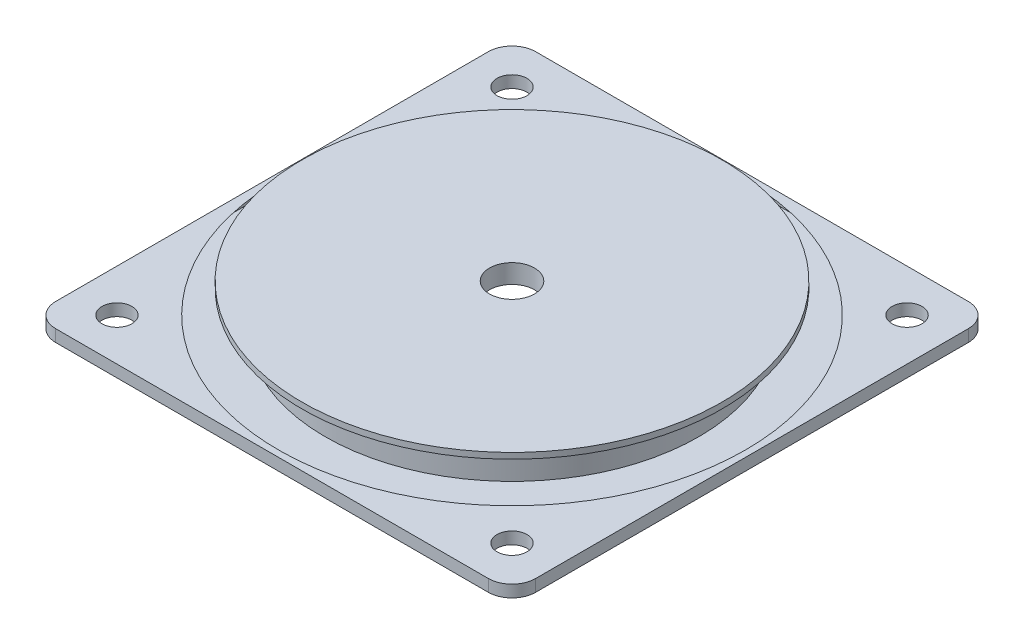
ISO-10303-21;
HEADER;
FILE_DESCRIPTION(('STEP AP214'),'2;1');
FILE_NAME('part.step','',(''),(''),'','','');
FILE_SCHEMA(('AUTOMOTIVE_DESIGN { 1 0 10303 214 1 1 1 1 }'));
ENDSEC;
DATA;
#1=APPLICATION_CONTEXT('core data for automotive mechanical design processes');
#2=APPLICATION_PROTOCOL_DEFINITION('international standard','automotive_design',2000,#1);
#3=PRODUCT_CONTEXT('',#1,'mechanical');
#4=PRODUCT('Part','Part','',(#3));
#5=PRODUCT_RELATED_PRODUCT_CATEGORY('part','',(#4));
#6=PRODUCT_DEFINITION_FORMATION('','',#4);
#7=PRODUCT_DEFINITION_CONTEXT('part definition',#1,'design');
#8=PRODUCT_DEFINITION('design','',#6,#7);
#9=PRODUCT_DEFINITION_SHAPE('','',#8);
#10=(LENGTH_UNIT() NAMED_UNIT(*) SI_UNIT(.MILLI.,.METRE.));
#11=(NAMED_UNIT(*) PLANE_ANGLE_UNIT() SI_UNIT($,.RADIAN.));
#12=(NAMED_UNIT(*) SI_UNIT($,.STERADIAN.) SOLID_ANGLE_UNIT());
#13=UNCERTAINTY_MEASURE_WITH_UNIT(LENGTH_MEASURE(1.E-05),#10,'distance_accuracy_value','');
#14=(GEOMETRIC_REPRESENTATION_CONTEXT(3) GLOBAL_UNCERTAINTY_ASSIGNED_CONTEXT((#13)) GLOBAL_UNIT_ASSIGNED_CONTEXT((#10,
#11,#12)) REPRESENTATION_CONTEXT('',''));
#15=CARTESIAN_POINT('',(0.,0.,0.));
#16=DIRECTION('',(0.,0.,1.));
#17=DIRECTION('',(1.,0.,0.));
#18=AXIS2_PLACEMENT_3D('',#15,#16,#17);
#19=CARTESIAN_POINT('',(-124.602514331042,-133.947084493501,-454.087475190436));
#20=DIRECTION('',(0.,1.,0.));
#21=DIRECTION('',(0.,0.,-1.));
#22=AXIS2_PLACEMENT_3D('',#19,#20,#21);
#23=PLANE('',#22);
#24=CARTESIAN_POINT('',(-124.602514331042,-133.947084493501,-454.087475190436));
#25=DIRECTION('',(0.,-1.,0.));
#26=DIRECTION('',(-1.,0.,0.));
#27=AXIS2_PLACEMENT_3D('',#24,#25,#26);
#28=CIRCLE('',#27,4.7625);
#29=CARTESIAN_POINT('',(-119.840014331042,-133.947084493501,-454.087475190436));
#30=VERTEX_POINT('',#29);
#31=EDGE_CURVE('E226',#30,#30,#28,.T.);
#32=ORIENTED_EDGE('',*,*,#31,.T.);
#33=EDGE_LOOP('',(#32));
#34=FACE_BOUND('',#33,.T.);
#35=CARTESIAN_POINT('',(-124.602514331042,-133.947084493501,-454.087475190436));
#36=DIRECTION('',(0.,1.,0.));
#37=DIRECTION('',(-0.994877763250626,0.,-0.101085291657253));
#38=AXIS2_PLACEMENT_3D('',#35,#36,#37);
#39=CIRCLE('',#38,44.45);
#40=CARTESIAN_POINT('',(-80.3801977545518,-133.947084493501,-449.594233976272));
#41=VERTEX_POINT('',#40);
#42=EDGE_CURVE('E11',#41,#41,#39,.T.);
#43=ORIENTED_EDGE('',*,*,#42,.T.);
#44=EDGE_LOOP('',(#43));
#45=FACE_BOUND('',#44,.T.);
#46=ADVANCED_FACE('F55',(#34,#45),#23,.T.);
#47=CARTESIAN_POINT('',(-124.602514331042,-143.847084493501,-454.087475190436));
#48=DIRECTION('',(0.,-1.,0.));
#49=DIRECTION('',(-0.994877763250626,0.,-0.101085291657253));
#50=AXIS2_PLACEMENT_3D('',#47,#48,#49);
#51=CYLINDRICAL_SURFACE('',#50,44.45);
#52=CARTESIAN_POINT('',(-124.602514331042,-135.1970844935,-454.087475190436));
#53=DIRECTION('',(0.,-1.,0.));
#54=DIRECTION('',(0.994877763250626,0.,0.101085291657253));
#55=AXIS2_PLACEMENT_3D('',#52,#53,#54);
#56=CIRCLE('',#55,44.45);
#57=CARTESIAN_POINT('',(-168.824830907532,-135.197084493501,-458.580716404601));
#58=VERTEX_POINT('',#57);
#59=CARTESIAN_POINT('',(-80.3801977545518,-135.197084493501,-449.594233976272));
#60=VERTEX_POINT('',#59);
#61=EDGE_CURVE('E210',#58,#60,#56,.T.);
#62=ORIENTED_EDGE('',*,*,#61,.F.);
#63=CARTESIAN_POINT('',(-124.602514331042,-135.1970844935,-454.087475190436));
#64=DIRECTION('',(0.,-1.,0.));
#65=DIRECTION('',(0.994877763250626,0.,0.101085291657253));
#66=AXIS2_PLACEMENT_3D('',#63,#64,#65);
#67=CIRCLE('',#66,44.45);
#68=EDGE_CURVE('E207',#60,#58,#67,.T.);
#69=ORIENTED_EDGE('',*,*,#68,.F.);
#70=DIRECTION('',(0.,1.,0.));
#71=VECTOR('',#70,1.);
#72=CARTESIAN_POINT('',(-80.3801977545518,-143.847084493501,-449.594233976272));
#73=LINE('',#72,#71);
#74=EDGE_CURVE('E63',#60,#41,#73,.T.);
#75=ORIENTED_EDGE('',*,*,#74,.T.);
#76=ORIENTED_EDGE('',*,*,#42,.F.);
#77=ORIENTED_EDGE('',*,*,#74,.F.);
#78=EDGE_LOOP('',(#62,#69,#75,#76,#77));
#79=FACE_BOUND('',#78,.T.);
#80=ADVANCED_FACE('F375',(#79),#51,.T.);
#81=CARTESIAN_POINT('',(-124.602514331042,-140.197084493501,-454.087475190436));
#82=DIRECTION('',(0.,1.,0.));
#83=DIRECTION('',(0.994877763250626,0.,0.101085291657253));
#84=AXIS2_PLACEMENT_3D('',#81,#82,#83);
#85=CYLINDRICAL_SURFACE('',#84,39.5466067773413);
#86=CARTESIAN_POINT('',(-124.602514331042,-142.737084493501,-454.087475190436));
#87=DIRECTION('',(0.,1.,0.));
#88=DIRECTION('',(-1.,0.,0.));
#89=AXIS2_PLACEMENT_3D('',#86,#87,#88);
#90=CIRCLE('',#89,39.5466067773413);
#91=CARTESIAN_POINT('',(-163.946554025835,-142.737084493501,-458.085055470579));
#92=VERTEX_POINT('',#91);
#93=EDGE_CURVE('E366',#92,#92,#90,.T.);
#94=ORIENTED_EDGE('',*,*,#93,.F.);
#95=DIRECTION('',(0.,1.,0.));
#96=VECTOR('',#95,1.);
#97=CARTESIAN_POINT('',(-163.946554025835,-140.197084493501,-458.085055470579));
#98=LINE('',#97,#96);
#99=CARTESIAN_POINT('',(-163.946554025835,-137.947084493501,-458.085055470579));
#100=VERTEX_POINT('',#99);
#101=EDGE_CURVE('E81',#92,#100,#98,.T.);
#102=ORIENTED_EDGE('',*,*,#101,.T.);
#103=CARTESIAN_POINT('',(-124.602514331042,-137.947084493501,-454.087475190436));
#104=DIRECTION('',(0.,1.,0.));
#105=DIRECTION('',(0.994877763250626,0.,0.101085291657253));
#106=AXIS2_PLACEMENT_3D('',#103,#104,#105);
#107=CIRCLE('',#106,39.5466067773413);
#108=EDGE_CURVE('E235',#100,#100,#107,.T.);
#109=ORIENTED_EDGE('',*,*,#108,.T.);
#110=ORIENTED_EDGE('',*,*,#101,.F.);
#111=EDGE_LOOP('',(#94,#102,#109,#110));
#112=FACE_BOUND('',#111,.T.);
#113=ADVANCED_FACE('F377',(#112),#85,.F.);
#114=CARTESIAN_POINT('',(-170.402514331042,-142.737084493501,-408.287475190437));
#115=DIRECTION('',(0.,1.,0.));
#116=DIRECTION('',(-0.707106781186548,0.,0.707106781186548));
#117=AXIS2_PLACEMENT_3D('',#114,#115,#116);
#118=CYLINDRICAL_SURFACE('',#117,5.);
#119=CARTESIAN_POINT('',(-170.402514331042,-140.197084493501,-408.287475190437));
#120=DIRECTION('',(0.,-1.,0.));
#121=DIRECTION('',(-0.707106781186548,0.,0.707106781186548));
#122=AXIS2_PLACEMENT_3D('',#119,#120,#121);
#123=CIRCLE('',#122,5.);
#124=CARTESIAN_POINT('',(-170.402514331042,-140.197084493501,-403.287475190437));
#125=VERTEX_POINT('',#124);
#126=CARTESIAN_POINT('',(-175.402514331042,-140.197084493501,-408.287475190437));
#127=VERTEX_POINT('',#126);
#128=EDGE_CURVE('E315',#125,#127,#123,.T.);
#129=ORIENTED_EDGE('',*,*,#128,.T.);
#130=DIRECTION('',(0.,-1.,0.));
#131=VECTOR('',#130,1.);
#132=CARTESIAN_POINT('',(-175.402514331042,-142.737084493501,-408.287475190437));
#133=LINE('',#132,#131);
#134=CARTESIAN_POINT('',(-175.402514331042,-142.737084493501,-408.287475190437));
#135=VERTEX_POINT('',#134);
#136=EDGE_CURVE('E232',#127,#135,#133,.T.);
#137=ORIENTED_EDGE('',*,*,#136,.T.);
#138=CARTESIAN_POINT('',(-170.402514331042,-142.7370844935,-408.287475190437));
#139=DIRECTION('',(0.,1.,0.));
#140=DIRECTION('',(-0.707106781186548,0.,0.707106781186548));
#141=AXIS2_PLACEMENT_3D('',#138,#139,#140);
#142=CIRCLE('',#141,5.);
#143=CARTESIAN_POINT('',(-170.402514331042,-142.7370844935,-403.287475190437));
#144=VERTEX_POINT('',#143);
#145=EDGE_CURVE('E357',#135,#144,#142,.T.);
#146=ORIENTED_EDGE('',*,*,#145,.T.);
#147=DIRECTION('',(0.,1.,0.));
#148=VECTOR('',#147,1.);
#149=CARTESIAN_POINT('',(-170.402514331042,-142.737084493501,-403.287475190437));
#150=LINE('',#149,#148);
#151=EDGE_CURVE('E359',#144,#125,#150,.T.);
#152=ORIENTED_EDGE('',*,*,#151,.T.);
#153=EDGE_LOOP('',(#129,#137,#146,#152));
#154=FACE_BOUND('',#153,.T.);
#155=ADVANCED_FACE('F384',(#154),#118,.T.);
#156=CARTESIAN_POINT('',(-175.402514331042,-142.7370844935,-403.287475190437));
#157=DIRECTION('',(0.,0.,1.));
#158=DIRECTION('',(0.,-1.,0.));
#159=AXIS2_PLACEMENT_3D('',#156,#157,#158);
#160=PLANE('',#159);
#161=ORIENTED_EDGE('',*,*,#151,.F.);
#162=DIRECTION('',(1.,0.,0.));
#163=VECTOR('',#162,1.);
#164=CARTESIAN_POINT('',(-175.402514331042,-142.7370844935,-403.287475190437));
#165=LINE('',#164,#163);
#166=CARTESIAN_POINT('',(-78.8025143310422,-142.737084493501,-403.287475190437));
#167=VERTEX_POINT('',#166);
#168=EDGE_CURVE('E363',#144,#167,#165,.T.);
#169=ORIENTED_EDGE('',*,*,#168,.T.);
#170=DIRECTION('',(0.,-1.,0.));
#171=VECTOR('',#170,1.);
#172=CARTESIAN_POINT('',(-78.8025143310422,-142.737084493501,-403.287475190437));
#173=LINE('',#172,#171);
#174=CARTESIAN_POINT('',(-78.8025143310422,-140.197084493501,-403.287475190437));
#175=VERTEX_POINT('',#174);
#176=EDGE_CURVE('E302',#175,#167,#173,.T.);
#177=ORIENTED_EDGE('',*,*,#176,.F.);
#178=DIRECTION('',(1.,0.,0.));
#179=VECTOR('',#178,1.);
#180=CARTESIAN_POINT('',(-175.402514331042,-140.197084493501,-403.287475190437));
#181=LINE('',#180,#179);
#182=EDGE_CURVE('E335',#125,#175,#181,.T.);
#183=ORIENTED_EDGE('',*,*,#182,.F.);
#184=EDGE_LOOP('',(#161,#169,#177,#183));
#185=FACE_BOUND('',#184,.T.);
#186=ADVANCED_FACE('F441',(#185),#160,.T.);
#187=CARTESIAN_POINT('',(-124.602514331042,-142.737084493501,-454.087475190436));
#188=DIRECTION('',(0.,1.,0.));
#189=DIRECTION('',(1.,0.,0.));
#190=AXIS2_PLACEMENT_3D('',#187,#188,#189);
#191=PLANE('',#190);
#192=CARTESIAN_POINT('',(-82.7827704521111,-142.737084493501,-495.907219069366));
#193=DIRECTION('',(0.,1.,0.));
#194=DIRECTION('',(0.,0.,-1.));
#195=AXIS2_PLACEMENT_3D('',#192,#193,#194);
#196=CIRCLE('',#195,3.175);
#197=CARTESIAN_POINT('',(-82.7827704521111,-142.737084493501,-492.732219069366));
#198=VERTEX_POINT('',#197);
#199=EDGE_CURVE('E295',#198,#198,#196,.T.);
#200=ORIENTED_EDGE('',*,*,#199,.T.);
#201=EDGE_LOOP('',(#200));
#202=FACE_BOUND('',#201,.T.);
#203=CARTESIAN_POINT('',(-82.7827704521115,-142.737084493501,-412.267731311505));
#204=DIRECTION('',(0.,1.,0.));
#205=DIRECTION('',(1.,0.,0.));
#206=AXIS2_PLACEMENT_3D('',#203,#204,#205);
#207=CIRCLE('',#206,3.175);
#208=CARTESIAN_POINT('',(-85.9577704521114,-142.737084493501,-412.267731311505));
#209=VERTEX_POINT('',#208);
#210=EDGE_CURVE('E257',#209,#209,#207,.T.);
#211=ORIENTED_EDGE('',*,*,#210,.T.);
#212=EDGE_LOOP('',(#211));
#213=FACE_BOUND('',#212,.T.);
#214=CARTESIAN_POINT('',(-166.422258209973,-142.737084493501,-412.267731311505));
#215=DIRECTION('',(0.,1.,0.));
#216=DIRECTION('',(0.,0.,1.));
#217=AXIS2_PLACEMENT_3D('',#214,#215,#216);
#218=CIRCLE('',#217,3.175);
#219=CARTESIAN_POINT('',(-166.422258209973,-142.737084493501,-415.442731311505));
#220=VERTEX_POINT('',#219);
#221=EDGE_CURVE('E264',#220,#220,#218,.T.);
#222=ORIENTED_EDGE('',*,*,#221,.T.);
#223=EDGE_LOOP('',(#222));
#224=FACE_BOUND('',#223,.T.);
#225=CARTESIAN_POINT('',(-166.422258209973,-142.737084493501,-495.907219069367));
#226=DIRECTION('',(0.,1.,0.));
#227=DIRECTION('',(-1.,0.,0.));
#228=AXIS2_PLACEMENT_3D('',#225,#226,#227);
#229=CIRCLE('',#228,3.175);
#230=CARTESIAN_POINT('',(-163.247258209973,-142.737084493501,-495.907219069367));
#231=VERTEX_POINT('',#230);
#232=EDGE_CURVE('E252',#231,#231,#229,.T.);
#233=ORIENTED_EDGE('',*,*,#232,.T.);
#234=EDGE_LOOP('',(#233));
#235=FACE_BOUND('',#234,.T.);
#236=ORIENTED_EDGE('',*,*,#93,.T.);
#237=EDGE_LOOP('',(#236));
#238=FACE_BOUND('',#237,.T.);
#239=ORIENTED_EDGE('',*,*,#145,.F.);
#240=DIRECTION('',(0.,0.,1.));
#241=VECTOR('',#240,1.);
#242=CARTESIAN_POINT('',(-175.402514331042,-142.7370844935,-504.887475190437));
#243=LINE('',#242,#241);
#244=CARTESIAN_POINT('',(-175.402514331042,-142.7370844935,-499.887475190437));
#245=VERTEX_POINT('',#244);
#246=EDGE_CURVE('E218',#245,#135,#243,.T.);
#247=ORIENTED_EDGE('',*,*,#246,.F.);
#248=CARTESIAN_POINT('',(-170.402514331042,-142.7370844935,-499.887475190437));
#249=DIRECTION('',(0.,1.,0.));
#250=DIRECTION('',(-0.707106781186548,0.,-0.707106781186548));
#251=AXIS2_PLACEMENT_3D('',#248,#249,#250);
#252=CIRCLE('',#251,5.);
#253=CARTESIAN_POINT('',(-170.402514331042,-142.7370844935,-504.887475190437));
#254=VERTEX_POINT('',#253);
#255=EDGE_CURVE('E354',#254,#245,#252,.T.);
#256=ORIENTED_EDGE('',*,*,#255,.F.);
#257=DIRECTION('',(-1.,0.,0.));
#258=VECTOR('',#257,1.);
#259=CARTESIAN_POINT('',(-175.402514331042,-142.7370844935,-504.887475190437));
#260=LINE('',#259,#258);
#261=CARTESIAN_POINT('',(-78.8025143310422,-142.737084493501,-504.887475190437));
#262=VERTEX_POINT('',#261);
#263=EDGE_CURVE('E350',#262,#254,#260,.T.);
#264=ORIENTED_EDGE('',*,*,#263,.F.);
#265=CARTESIAN_POINT('',(-78.8025143310422,-142.737084493501,-499.887475190437));
#266=DIRECTION('',(0.,1.,0.));
#267=DIRECTION('',(0.707106781186548,0.,-0.707106781186548));
#268=AXIS2_PLACEMENT_3D('',#265,#266,#267);
#269=CIRCLE('',#268,5.);
#270=CARTESIAN_POINT('',(-73.8025143310422,-142.737084493501,-499.887475190437));
#271=VERTEX_POINT('',#270);
#272=EDGE_CURVE('E262',#271,#262,#269,.T.);
#273=ORIENTED_EDGE('',*,*,#272,.F.);
#274=DIRECTION('',(0.,0.,-1.));
#275=VECTOR('',#274,1.);
#276=CARTESIAN_POINT('',(-73.8025143310422,-142.737084493501,-504.887475190437));
#277=LINE('',#276,#275);
#278=CARTESIAN_POINT('',(-73.8025143310422,-142.737084493501,-408.287475190437));
#279=VERTEX_POINT('',#278);
#280=EDGE_CURVE('E263',#279,#271,#277,.T.);
#281=ORIENTED_EDGE('',*,*,#280,.F.);
#282=CARTESIAN_POINT('',(-78.8025143310422,-142.737084493501,-408.287475190437));
#283=DIRECTION('',(0.,1.,0.));
#284=DIRECTION('',(0.707106781186548,0.,0.707106781186548));
#285=AXIS2_PLACEMENT_3D('',#282,#283,#284);
#286=CIRCLE('',#285,5.);
#287=EDGE_CURVE('E306',#167,#279,#286,.T.);
#288=ORIENTED_EDGE('',*,*,#287,.F.);
#289=ORIENTED_EDGE('',*,*,#168,.F.);
#290=EDGE_LOOP('',(#239,#247,#256,#264,#273,#281,#288,#289));
#291=FACE_BOUND('',#290,.T.);
#292=ADVANCED_FACE('F393',(#202,#213,#224,#235,#238,#291),#191,.F.);
#293=CARTESIAN_POINT('',(-170.402514331042,-142.7370844935,-499.887475190437));
#294=DIRECTION('',(0.,1.,0.));
#295=DIRECTION('',(-0.707106781186548,0.,-0.707106781186548));
#296=AXIS2_PLACEMENT_3D('',#293,#294,#295);
#297=CYLINDRICAL_SURFACE('',#296,5.);
#298=CARTESIAN_POINT('',(-170.402514331042,-140.1970844935,-499.887475190437));
#299=DIRECTION('',(0.,-1.,0.));
#300=DIRECTION('',(-0.707106781186548,0.,-0.707106781186548));
#301=AXIS2_PLACEMENT_3D('',#298,#299,#300);
#302=CIRCLE('',#301,5.);
#303=CARTESIAN_POINT('',(-175.402514331042,-140.197084493501,-499.887475190437));
#304=VERTEX_POINT('',#303);
#305=CARTESIAN_POINT('',(-170.402514331042,-140.197084493501,-504.887475190437));
#306=VERTEX_POINT('',#305);
#307=EDGE_CURVE('E342',#304,#306,#302,.T.);
#308=ORIENTED_EDGE('',*,*,#307,.T.);
#309=DIRECTION('',(0.,-1.,0.));
#310=VECTOR('',#309,1.);
#311=CARTESIAN_POINT('',(-170.402514331042,-142.7370844935,-504.887475190437));
#312=LINE('',#311,#310);
#313=EDGE_CURVE('E346',#306,#254,#312,.T.);
#314=ORIENTED_EDGE('',*,*,#313,.T.);
#315=ORIENTED_EDGE('',*,*,#255,.T.);
#316=DIRECTION('',(0.,1.,0.));
#317=VECTOR('',#316,1.);
#318=CARTESIAN_POINT('',(-175.402514331042,-142.7370844935,-499.887475190437));
#319=LINE('',#318,#317);
#320=EDGE_CURVE('E231',#245,#304,#319,.T.);
#321=ORIENTED_EDGE('',*,*,#320,.T.);
#322=EDGE_LOOP('',(#308,#314,#315,#321));
#323=FACE_BOUND('',#322,.T.);
#324=ADVANCED_FACE('F389',(#323),#297,.T.);
#325=CARTESIAN_POINT('',(-175.402514331042,-142.7370844935,-504.887475190437));
#326=DIRECTION('',(0.,0.,-1.));
#327=DIRECTION('',(-1.,0.,0.));
#328=AXIS2_PLACEMENT_3D('',#325,#326,#327);
#329=PLANE('',#328);
#330=ORIENTED_EDGE('',*,*,#313,.F.);
#331=DIRECTION('',(-1.,0.,0.));
#332=VECTOR('',#331,1.);
#333=CARTESIAN_POINT('',(-175.402514331042,-140.197084493501,-504.887475190437));
#334=LINE('',#333,#332);
#335=CARTESIAN_POINT('',(-78.8025143310422,-140.197084493501,-504.887475190437));
#336=VERTEX_POINT('',#335);
#337=EDGE_CURVE('E338',#336,#306,#334,.T.);
#338=ORIENTED_EDGE('',*,*,#337,.F.);
#339=DIRECTION('',(0.,1.,0.));
#340=VECTOR('',#339,1.);
#341=CARTESIAN_POINT('',(-78.8025143310422,-142.737084493501,-504.887475190437));
#342=LINE('',#341,#340);
#343=EDGE_CURVE('E311',#262,#336,#342,.T.);
#344=ORIENTED_EDGE('',*,*,#343,.F.);
#345=ORIENTED_EDGE('',*,*,#263,.T.);
#346=EDGE_LOOP('',(#330,#338,#344,#345));
#347=FACE_BOUND('',#346,.T.);
#348=ADVANCED_FACE('F392',(#347),#329,.T.);
#349=CARTESIAN_POINT('',(-124.602514331042,-140.197084493501,-454.087475190436));
#350=DIRECTION('',(0.,1.,0.));
#351=DIRECTION('',(1.,0.,0.));
#352=AXIS2_PLACEMENT_3D('',#349,#350,#351);
#353=PLANE('',#352);
#354=CARTESIAN_POINT('',(-82.7827704521111,-140.197084493501,-495.907219069366));
#355=DIRECTION('',(0.,-1.,0.));
#356=DIRECTION('',(0.,0.,-1.));
#357=AXIS2_PLACEMENT_3D('',#354,#355,#356);
#358=CIRCLE('',#357,3.175);
#359=CARTESIAN_POINT('',(-82.7827704521111,-140.197084493501,-492.732219069366));
#360=VERTEX_POINT('',#359);
#361=EDGE_CURVE('E253',#360,#360,#358,.T.);
#362=ORIENTED_EDGE('',*,*,#361,.T.);
#363=EDGE_LOOP('',(#362));
#364=FACE_BOUND('',#363,.T.);
#365=CARTESIAN_POINT('',(-82.7827704521115,-140.197084493501,-412.267731311505));
#366=DIRECTION('',(0.,-1.,0.));
#367=DIRECTION('',(1.,0.,0.));
#368=AXIS2_PLACEMENT_3D('',#365,#366,#367);
#369=CIRCLE('',#368,3.175);
#370=CARTESIAN_POINT('',(-85.9577704521114,-140.197084493501,-412.267731311505));
#371=VERTEX_POINT('',#370);
#372=EDGE_CURVE('E267',#371,#371,#369,.T.);
#373=ORIENTED_EDGE('',*,*,#372,.T.);
#374=EDGE_LOOP('',(#373));
#375=FACE_BOUND('',#374,.T.);
#376=CARTESIAN_POINT('',(-166.422258209973,-140.197084493501,-412.267731311505));
#377=DIRECTION('',(0.,-1.,0.));
#378=DIRECTION('',(0.,0.,1.));
#379=AXIS2_PLACEMENT_3D('',#376,#377,#378);
#380=CIRCLE('',#379,3.175);
#381=CARTESIAN_POINT('',(-166.422258209973,-140.197084493501,-415.442731311505));
#382=VERTEX_POINT('',#381);
#383=EDGE_CURVE('E247',#382,#382,#380,.T.);
#384=ORIENTED_EDGE('',*,*,#383,.T.);
#385=EDGE_LOOP('',(#384));
#386=FACE_BOUND('',#385,.T.);
#387=CARTESIAN_POINT('',(-166.422258209973,-140.197084493501,-495.907219069367));
#388=DIRECTION('',(0.,-1.,0.));
#389=DIRECTION('',(-1.,0.,0.));
#390=AXIS2_PLACEMENT_3D('',#387,#388,#389);
#391=CIRCLE('',#390,3.175);
#392=CARTESIAN_POINT('',(-163.247258209973,-140.197084493501,-495.907219069367));
#393=VERTEX_POINT('',#392);
#394=EDGE_CURVE('E270',#393,#393,#391,.T.);
#395=ORIENTED_EDGE('',*,*,#394,.T.);
#396=EDGE_LOOP('',(#395));
#397=FACE_BOUND('',#396,.T.);
#398=CARTESIAN_POINT('',(-124.602514331042,-140.197084493501,-454.087475190436));
#399=DIRECTION('',(0.,1.,0.));
#400=DIRECTION('',(0.994877763250626,0.,0.101085291657253));
#401=AXIS2_PLACEMENT_3D('',#398,#399,#400);
#402=CIRCLE('',#401,49.45);
#403=CARTESIAN_POINT('',(-173.799219723785,-140.1970844935,-459.086142862888));
#404=VERTEX_POINT('',#403);
#405=EDGE_CURVE('E204',#404,#404,#402,.T.);
#406=ORIENTED_EDGE('',*,*,#405,.F.);
#407=EDGE_LOOP('',(#406));
#408=FACE_BOUND('',#407,.T.);
#409=ORIENTED_EDGE('',*,*,#128,.F.);
#410=ORIENTED_EDGE('',*,*,#182,.T.);
#411=CARTESIAN_POINT('',(-78.8025143310422,-140.197084493501,-408.287475190437));
#412=DIRECTION('',(0.,-1.,0.));
#413=DIRECTION('',(0.707106781186548,0.,0.707106781186548));
#414=AXIS2_PLACEMENT_3D('',#411,#412,#413);
#415=CIRCLE('',#414,5.);
#416=CARTESIAN_POINT('',(-73.8025143310422,-140.197084493501,-408.287475190437));
#417=VERTEX_POINT('',#416);
#418=EDGE_CURVE('E298',#417,#175,#415,.T.);
#419=ORIENTED_EDGE('',*,*,#418,.F.);
#420=DIRECTION('',(0.,0.,-1.));
#421=VECTOR('',#420,1.);
#422=CARTESIAN_POINT('',(-73.8025143310422,-140.197084493501,-504.887475190437));
#423=LINE('',#422,#421);
#424=CARTESIAN_POINT('',(-73.8025143310422,-140.197084493501,-499.887475190437));
#425=VERTEX_POINT('',#424);
#426=EDGE_CURVE('E323',#417,#425,#423,.T.);
#427=ORIENTED_EDGE('',*,*,#426,.T.);
#428=CARTESIAN_POINT('',(-78.8025143310422,-140.197084493501,-499.887475190437));
#429=DIRECTION('',(0.,-1.,0.));
#430=DIRECTION('',(0.707106781186548,0.,-0.707106781186548));
#431=AXIS2_PLACEMENT_3D('',#428,#429,#430);
#432=CIRCLE('',#431,5.);
#433=EDGE_CURVE('E259',#336,#425,#432,.T.);
#434=ORIENTED_EDGE('',*,*,#433,.F.);
#435=ORIENTED_EDGE('',*,*,#337,.T.);
#436=ORIENTED_EDGE('',*,*,#307,.F.);
#437=DIRECTION('',(0.,0.,1.));
#438=VECTOR('',#437,1.);
#439=CARTESIAN_POINT('',(-175.402514331042,-140.197084493501,-504.887475190437));
#440=LINE('',#439,#438);
#441=EDGE_CURVE('E227',#304,#127,#440,.T.);
#442=ORIENTED_EDGE('',*,*,#441,.T.);
#443=EDGE_LOOP('',(#409,#410,#419,#427,#434,#435,#436,#442));
#444=FACE_BOUND('',#443,.T.);
#445=ADVANCED_FACE('F397',(#364,#375,#386,#397,#408,#444),#353,.T.);
#446=CARTESIAN_POINT('',(-78.8025143310422,-142.737084493501,-499.887475190437));
#447=DIRECTION('',(0.,1.,0.));
#448=DIRECTION('',(0.707106781186548,0.,-0.707106781186548));
#449=AXIS2_PLACEMENT_3D('',#446,#447,#448);
#450=CYLINDRICAL_SURFACE('',#449,5.);
#451=ORIENTED_EDGE('',*,*,#433,.T.);
#452=DIRECTION('',(0.,-1.,0.));
#453=VECTOR('',#452,1.);
#454=CARTESIAN_POINT('',(-73.8025143310422,-142.737084493501,-499.887475190437));
#455=LINE('',#454,#453);
#456=EDGE_CURVE('E319',#425,#271,#455,.T.);
#457=ORIENTED_EDGE('',*,*,#456,.T.);
#458=ORIENTED_EDGE('',*,*,#272,.T.);
#459=ORIENTED_EDGE('',*,*,#343,.T.);
#460=EDGE_LOOP('',(#451,#457,#458,#459));
#461=FACE_BOUND('',#460,.T.);
#462=ADVANCED_FACE('F407',(#461),#450,.T.);
#463=CARTESIAN_POINT('',(-73.8025143310422,-142.737084493501,-504.887475190437));
#464=DIRECTION('',(1.,0.,0.));
#465=DIRECTION('',(0.,-1.,0.));
#466=AXIS2_PLACEMENT_3D('',#463,#464,#465);
#467=PLANE('',#466);
#468=ORIENTED_EDGE('',*,*,#456,.F.);
#469=ORIENTED_EDGE('',*,*,#426,.F.);
#470=DIRECTION('',(0.,1.,0.));
#471=VECTOR('',#470,1.);
#472=CARTESIAN_POINT('',(-73.8025143310422,-142.737084493501,-408.287475190437));
#473=LINE('',#472,#471);
#474=EDGE_CURVE('E310',#279,#417,#473,.T.);
#475=ORIENTED_EDGE('',*,*,#474,.F.);
#476=ORIENTED_EDGE('',*,*,#280,.T.);
#477=EDGE_LOOP('',(#468,#469,#475,#476));
#478=FACE_BOUND('',#477,.T.);
#479=ADVANCED_FACE('F409',(#478),#467,.T.);
#480=CARTESIAN_POINT('',(-78.8025143310422,-142.737084493501,-408.287475190437));
#481=DIRECTION('',(0.,1.,0.));
#482=DIRECTION('',(0.707106781186548,0.,0.707106781186548));
#483=AXIS2_PLACEMENT_3D('',#480,#481,#482);
#484=CYLINDRICAL_SURFACE('',#483,5.);
#485=ORIENTED_EDGE('',*,*,#418,.T.);
#486=ORIENTED_EDGE('',*,*,#176,.T.);
#487=ORIENTED_EDGE('',*,*,#287,.T.);
#488=ORIENTED_EDGE('',*,*,#474,.T.);
#489=EDGE_LOOP('',(#485,#486,#487,#488));
#490=FACE_BOUND('',#489,.T.);
#491=ADVANCED_FACE('F403',(#490),#484,.T.);
#492=CARTESIAN_POINT('',(-82.7827704521111,-140.197084493501,-495.907219069366));
#493=DIRECTION('',(0.,-1.,0.));
#494=DIRECTION('',(0.,0.,-1.));
#495=AXIS2_PLACEMENT_3D('',#492,#493,#494);
#496=CYLINDRICAL_SURFACE('',#495,3.175);
#497=ORIENTED_EDGE('',*,*,#361,.F.);
#498=DIRECTION('',(0.,-1.,0.));
#499=VECTOR('',#498,1.);
#500=CARTESIAN_POINT('',(-82.7827704521111,-140.197084493501,-492.732219069366));
#501=LINE('',#500,#499);
#502=EDGE_CURVE('E256',#360,#198,#501,.T.);
#503=ORIENTED_EDGE('',*,*,#502,.T.);
#504=ORIENTED_EDGE('',*,*,#199,.F.);
#505=ORIENTED_EDGE('',*,*,#502,.F.);
#506=EDGE_LOOP('',(#497,#503,#504,#505));
#507=FACE_BOUND('',#506,.T.);
#508=ADVANCED_FACE('F399',(#507),#496,.F.);
#509=CARTESIAN_POINT('',(-82.7827704521115,-140.197084493501,-412.267731311505));
#510=DIRECTION('',(0.,-1.,0.));
#511=DIRECTION('',(1.,0.,0.));
#512=AXIS2_PLACEMENT_3D('',#509,#510,#511);
#513=CYLINDRICAL_SURFACE('',#512,3.175);
#514=ORIENTED_EDGE('',*,*,#372,.F.);
#515=DIRECTION('',(0.,-1.,0.));
#516=VECTOR('',#515,1.);
#517=CARTESIAN_POINT('',(-85.9577704521114,-140.197084493501,-412.267731311505));
#518=LINE('',#517,#516);
#519=EDGE_CURVE('E283',#371,#209,#518,.T.);
#520=ORIENTED_EDGE('',*,*,#519,.T.);
#521=ORIENTED_EDGE('',*,*,#210,.F.);
#522=ORIENTED_EDGE('',*,*,#519,.F.);
#523=EDGE_LOOP('',(#514,#520,#521,#522));
#524=FACE_BOUND('',#523,.T.);
#525=ADVANCED_FACE('F402',(#524),#513,.F.);
#526=CARTESIAN_POINT('',(-166.422258209973,-140.197084493501,-412.267731311505));
#527=DIRECTION('',(0.,-1.,0.));
#528=DIRECTION('',(0.,0.,1.));
#529=AXIS2_PLACEMENT_3D('',#526,#527,#528);
#530=CYLINDRICAL_SURFACE('',#529,3.175);
#531=ORIENTED_EDGE('',*,*,#383,.F.);
#532=DIRECTION('',(0.,-1.,0.));
#533=VECTOR('',#532,1.);
#534=CARTESIAN_POINT('',(-166.422258209973,-140.197084493501,-415.442731311505));
#535=LINE('',#534,#533);
#536=EDGE_CURVE('E251',#382,#220,#535,.T.);
#537=ORIENTED_EDGE('',*,*,#536,.T.);
#538=ORIENTED_EDGE('',*,*,#221,.F.);
#539=ORIENTED_EDGE('',*,*,#536,.F.);
#540=EDGE_LOOP('',(#531,#537,#538,#539));
#541=FACE_BOUND('',#540,.T.);
#542=ADVANCED_FACE('F415',(#541),#530,.F.);
#543=CARTESIAN_POINT('',(-166.422258209973,-140.197084493501,-495.907219069367));
#544=DIRECTION('',(0.,-1.,0.));
#545=DIRECTION('',(-1.,0.,0.));
#546=AXIS2_PLACEMENT_3D('',#543,#544,#545);
#547=CYLINDRICAL_SURFACE('',#546,3.175);
#548=ORIENTED_EDGE('',*,*,#394,.F.);
#549=DIRECTION('',(0.,-1.,0.));
#550=VECTOR('',#549,1.);
#551=CARTESIAN_POINT('',(-163.247258209973,-140.197084493501,-495.907219069367));
#552=LINE('',#551,#550);
#553=EDGE_CURVE('E271',#393,#231,#552,.T.);
#554=ORIENTED_EDGE('',*,*,#553,.T.);
#555=ORIENTED_EDGE('',*,*,#232,.F.);
#556=ORIENTED_EDGE('',*,*,#553,.F.);
#557=EDGE_LOOP('',(#548,#554,#555,#556));
#558=FACE_BOUND('',#557,.T.);
#559=ADVANCED_FACE('F422',(#558),#547,.F.);
#560=CARTESIAN_POINT('',(-124.602514331042,-137.697084493501,-454.087475190436));
#561=DIRECTION('',(0.,-1.,0.));
#562=DIRECTION('',(0.994877763250626,0.,0.101085291657253));
#563=AXIS2_PLACEMENT_3D('',#560,#561,#562);
#564=CONICAL_SURFACE('',#563,46.95,0.785398163397448);
#565=ORIENTED_EDGE('',*,*,#405,.T.);
#566=DIRECTION('',(0.703484812846217,0.707106781186553,0.0714780952090628));
#567=VECTOR('',#566,1.);
#568=CARTESIAN_POINT('',(-171.312025315659,-137.6970844935,-458.833429633745));
#569=LINE('',#568,#567);
#570=EDGE_CURVE('E201',#404,#58,#569,.T.);
#571=ORIENTED_EDGE('',*,*,#570,.T.);
#572=ORIENTED_EDGE('',*,*,#61,.T.);
#573=ORIENTED_EDGE('',*,*,#68,.T.);
#574=ORIENTED_EDGE('',*,*,#570,.F.);
#575=EDGE_LOOP('',(#565,#571,#572,#573,#574));
#576=FACE_BOUND('',#575,.T.);
#577=ADVANCED_FACE('F202',(#576),#564,.T.);
#578=CARTESIAN_POINT('',(-175.402514331042,-142.7370844935,-504.887475190437));
#579=DIRECTION('',(-1.,0.,0.));
#580=DIRECTION('',(0.,0.,1.));
#581=AXIS2_PLACEMENT_3D('',#578,#579,#580);
#582=PLANE('',#581);
#583=ORIENTED_EDGE('',*,*,#136,.F.);
#584=ORIENTED_EDGE('',*,*,#441,.F.);
#585=ORIENTED_EDGE('',*,*,#320,.F.);
#586=ORIENTED_EDGE('',*,*,#246,.T.);
#587=EDGE_LOOP('',(#583,#584,#585,#586));
#588=FACE_BOUND('',#587,.T.);
#589=ADVANCED_FACE('F430',(#588),#582,.T.);
#590=CARTESIAN_POINT('',(-124.602514331042,-137.947084493501,-454.087475190436));
#591=DIRECTION('',(0.,1.,0.));
#592=DIRECTION('',(0.,0.,-1.));
#593=AXIS2_PLACEMENT_3D('',#590,#591,#592);
#594=PLANE('',#593);
#595=CARTESIAN_POINT('',(-124.602514331042,-137.947084493501,-454.087475190436));
#596=DIRECTION('',(0.,1.,0.));
#597=DIRECTION('',(-1.,0.,0.));
#598=AXIS2_PLACEMENT_3D('',#595,#596,#597);
#599=CIRCLE('',#598,4.7625);
#600=CARTESIAN_POINT('',(-119.840014331042,-137.947084493501,-454.087475190436));
#601=VERTEX_POINT('',#600);
#602=EDGE_CURVE('E222',#601,#601,#599,.T.);
#603=ORIENTED_EDGE('',*,*,#602,.T.);
#604=EDGE_LOOP('',(#603));
#605=FACE_BOUND('',#604,.T.);
#606=ORIENTED_EDGE('',*,*,#108,.F.);
#607=EDGE_LOOP('',(#606));
#608=FACE_BOUND('',#607,.T.);
#609=ADVANCED_FACE('F433',(#605,#608),#594,.F.);
#610=CARTESIAN_POINT('',(-124.602514331042,-133.947084493501,-454.087475190436));
#611=DIRECTION('',(0.,-1.,0.));
#612=DIRECTION('',(-1.,0.,0.));
#613=AXIS2_PLACEMENT_3D('',#610,#611,#612);
#614=CYLINDRICAL_SURFACE('',#613,4.7625);
#615=ORIENTED_EDGE('',*,*,#602,.F.);
#616=DIRECTION('',(0.,1.,0.));
#617=VECTOR('',#616,1.);
#618=CARTESIAN_POINT('',(-119.840014331042,-133.947084493501,-454.087475190436));
#619=LINE('',#618,#617);
#620=EDGE_CURVE('E223',#601,#30,#619,.T.);
#621=ORIENTED_EDGE('',*,*,#620,.T.);
#622=ORIENTED_EDGE('',*,*,#31,.F.);
#623=ORIENTED_EDGE('',*,*,#620,.F.);
#624=EDGE_LOOP('',(#615,#621,#622,#623));
#625=FACE_BOUND('',#624,.T.);
#626=ADVANCED_FACE('F437',(#625),#614,.F.);
#627=CLOSED_SHELL('',(#46,#80,#113,#155,#186,#292,#324,#348,#445,#462,#479,#491,#508,#525,#542,
#559,#577,#589,#609,#626));
#628=MANIFOLD_SOLID_BREP('B2',#627);
#629=ADVANCED_BREP_SHAPE_REPRESENTATION('',(#18,#628),#14);
#630=SHAPE_DEFINITION_REPRESENTATION(#9,#629);
ENDSEC;
END-ISO-10303-21;
